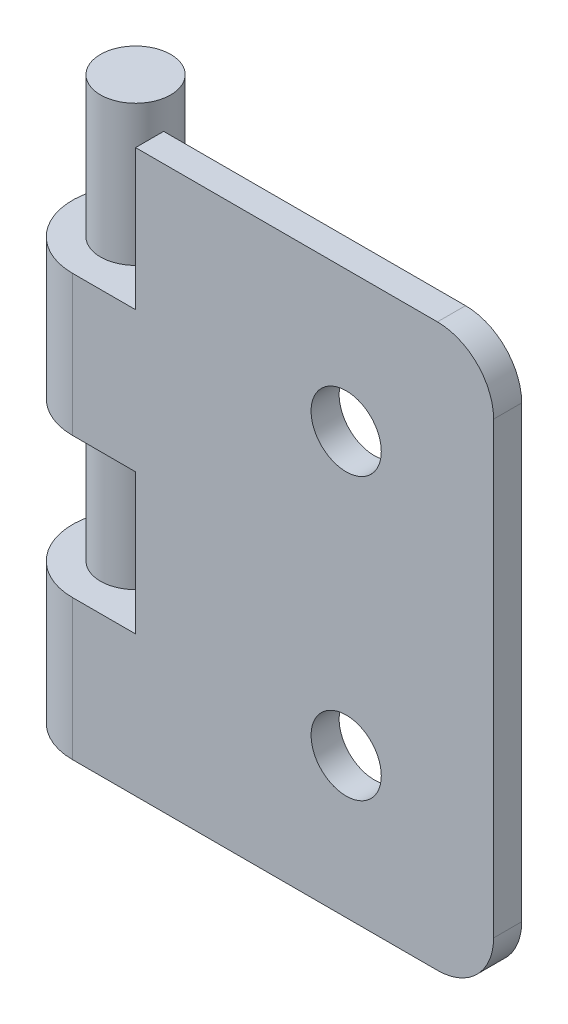
ISO-10303-21;
HEADER;
FILE_DESCRIPTION(('STEP AP214'),'2;1');
FILE_NAME('part.step','',(''),(''),'','','');
FILE_SCHEMA(('AUTOMOTIVE_DESIGN { 1 0 10303 214 1 1 1 1 }'));
ENDSEC;
DATA;
#1=APPLICATION_CONTEXT('core data for automotive mechanical design processes');
#2=APPLICATION_PROTOCOL_DEFINITION('international standard','automotive_design',2000,#1);
#3=PRODUCT_CONTEXT('',#1,'mechanical');
#4=PRODUCT('Part','Part','',(#3));
#5=PRODUCT_RELATED_PRODUCT_CATEGORY('part','',(#4));
#6=PRODUCT_DEFINITION_FORMATION('','',#4);
#7=PRODUCT_DEFINITION_CONTEXT('part definition',#1,'design');
#8=PRODUCT_DEFINITION('design','',#6,#7);
#9=PRODUCT_DEFINITION_SHAPE('','',#8);
#10=(LENGTH_UNIT() NAMED_UNIT(*) SI_UNIT(.MILLI.,.METRE.));
#11=(NAMED_UNIT(*) PLANE_ANGLE_UNIT() SI_UNIT($,.RADIAN.));
#12=(NAMED_UNIT(*) SI_UNIT($,.STERADIAN.) SOLID_ANGLE_UNIT());
#13=UNCERTAINTY_MEASURE_WITH_UNIT(LENGTH_MEASURE(1.E-05),#10,'distance_accuracy_value','');
#14=(GEOMETRIC_REPRESENTATION_CONTEXT(3) GLOBAL_UNCERTAINTY_ASSIGNED_CONTEXT((#13)) GLOBAL_UNIT_ASSIGNED_CONTEXT((#10,
#11,#12)) REPRESENTATION_CONTEXT('',''));
#15=CARTESIAN_POINT('',(0.,0.,0.));
#16=DIRECTION('',(0.,0.,1.));
#17=DIRECTION('',(1.,0.,0.));
#18=AXIS2_PLACEMENT_3D('',#15,#16,#17);
#19=CARTESIAN_POINT('',(0.,40.,0.));
#20=DIRECTION('',(0.,-1.,0.));
#21=DIRECTION('',(0.,0.,-1.));
#22=AXIS2_PLACEMENT_3D('',#19,#20,#21);
#23=CYLINDRICAL_SURFACE('',#22,4.5);
#24=CARTESIAN_POINT('',(0.,30.,0.));
#25=DIRECTION('',(0.,-1.,0.));
#26=DIRECTION('',(0.,0.,-1.));
#27=AXIS2_PLACEMENT_3D('',#24,#25,#26);
#28=CIRCLE('',#27,4.5);
#29=CARTESIAN_POINT('',(0.,30.,4.5));
#30=VERTEX_POINT('',#29);
#31=CARTESIAN_POINT('',(3.74165738677394,30.,2.5));
#32=VERTEX_POINT('',#31);
#33=EDGE_CURVE('E157',#30,#32,#28,.T.);
#34=ORIENTED_EDGE('',*,*,#33,.T.);
#35=DIRECTION('',(0.,-1.,0.));
#36=VECTOR('',#35,1.);
#37=CARTESIAN_POINT('',(3.74165738677394,40.,2.5));
#38=LINE('',#37,#36);
#39=CARTESIAN_POINT('',(3.74165738677394,20.,2.5));
#40=VERTEX_POINT('',#39);
#41=EDGE_CURVE('E187',#32,#40,#38,.T.);
#42=ORIENTED_EDGE('',*,*,#41,.T.);
#43=CARTESIAN_POINT('',(0.,20.,0.));
#44=DIRECTION('',(0.,1.,0.));
#45=DIRECTION('',(0.,0.,1.));
#46=AXIS2_PLACEMENT_3D('',#43,#44,#45);
#47=CIRCLE('',#46,4.5);
#48=CARTESIAN_POINT('',(0.,20.,4.5));
#49=VERTEX_POINT('',#48);
#50=EDGE_CURVE('E245',#40,#49,#47,.T.);
#51=ORIENTED_EDGE('',*,*,#50,.T.);
#52=DIRECTION('',(0.,-1.,0.));
#53=VECTOR('',#52,1.);
#54=CARTESIAN_POINT('',(0.,40.,4.5));
#55=LINE('',#54,#53);
#56=EDGE_CURVE('E195',#30,#49,#55,.T.);
#57=ORIENTED_EDGE('',*,*,#56,.F.);
#58=EDGE_LOOP('',(#34,#42,#51,#57));
#59=FACE_BOUND('',#58,.T.);
#60=ADVANCED_FACE('F35',(#59),#23,.T.);
#61=CARTESIAN_POINT('',(0.,40.,0.));
#62=DIRECTION('',(0.,1.,0.));
#63=DIRECTION('',(0.,0.,1.));
#64=AXIS2_PLACEMENT_3D('',#61,#62,#63);
#65=PLANE('',#64);
#66=DIRECTION('',(1.,0.,0.));
#67=VECTOR('',#66,1.);
#68=CARTESIAN_POINT('',(0.,40.,4.5));
#69=LINE('',#68,#67);
#70=CARTESIAN_POINT('',(4.5,40.,4.5));
#71=VERTEX_POINT('',#70);
#72=CARTESIAN_POINT('',(26.,40.,4.5));
#73=VERTEX_POINT('',#72);
#74=EDGE_CURVE('E173',#71,#73,#69,.T.);
#75=ORIENTED_EDGE('',*,*,#74,.T.);
#76=DIRECTION('',(0.,0.,-1.));
#77=VECTOR('',#76,1.);
#78=CARTESIAN_POINT('',(26.,40.,2.5));
#79=LINE('',#78,#77);
#80=CARTESIAN_POINT('',(26.,40.,2.5));
#81=VERTEX_POINT('',#80);
#82=EDGE_CURVE('E200',#73,#81,#79,.T.);
#83=ORIENTED_EDGE('',*,*,#82,.T.);
#84=DIRECTION('',(-1.,0.,0.));
#85=VECTOR('',#84,1.);
#86=CARTESIAN_POINT('',(30.,40.,2.5));
#87=LINE('',#86,#85);
#88=CARTESIAN_POINT('',(4.5,40.,2.5));
#89=VERTEX_POINT('',#88);
#90=EDGE_CURVE('E176',#81,#89,#87,.T.);
#91=ORIENTED_EDGE('',*,*,#90,.T.);
#92=DIRECTION('',(0.,0.,-1.));
#93=VECTOR('',#92,1.);
#94=CARTESIAN_POINT('',(4.5,40.,22.5));
#95=LINE('',#94,#93);
#96=EDGE_CURVE('E222',#71,#89,#95,.T.);
#97=ORIENTED_EDGE('',*,*,#96,.F.);
#98=EDGE_LOOP('',(#75,#83,#91,#97));
#99=FACE_BOUND('',#98,.T.);
#100=ADVANCED_FACE('F219',(#99),#65,.T.);
#101=CARTESIAN_POINT('',(0.,0.,0.));
#102=DIRECTION('',(0.,1.,0.));
#103=DIRECTION('',(0.,0.,1.));
#104=AXIS2_PLACEMENT_3D('',#101,#102,#103);
#105=PLANE('',#104);
#106=DIRECTION('',(-1.,0.,0.));
#107=VECTOR('',#106,1.);
#108=CARTESIAN_POINT('',(30.,0.,2.5));
#109=LINE('',#108,#107);
#110=CARTESIAN_POINT('',(26.,0.,2.5));
#111=VERTEX_POINT('',#110);
#112=CARTESIAN_POINT('',(3.74165738677394,0.,2.5));
#113=VERTEX_POINT('',#112);
#114=EDGE_CURVE('E177',#111,#113,#109,.T.);
#115=ORIENTED_EDGE('',*,*,#114,.F.);
#116=DIRECTION('',(0.,0.,-1.));
#117=VECTOR('',#116,1.);
#118=CARTESIAN_POINT('',(26.,0.,0.));
#119=LINE('',#118,#117);
#120=CARTESIAN_POINT('',(26.,0.,4.5));
#121=VERTEX_POINT('',#120);
#122=EDGE_CURVE('E11',#111,#121,#119,.F.);
#123=ORIENTED_EDGE('',*,*,#122,.T.);
#124=DIRECTION('',(1.,0.,0.));
#125=VECTOR('',#124,1.);
#126=CARTESIAN_POINT('',(0.,0.,4.5));
#127=LINE('',#126,#125);
#128=CARTESIAN_POINT('',(0.,0.,4.5));
#129=VERTEX_POINT('',#128);
#130=EDGE_CURVE('E182',#129,#121,#127,.T.);
#131=ORIENTED_EDGE('',*,*,#130,.F.);
#132=CARTESIAN_POINT('',(0.,0.,0.));
#133=DIRECTION('',(0.,1.,0.));
#134=DIRECTION('',(0.,0.,1.));
#135=AXIS2_PLACEMENT_3D('',#132,#133,#134);
#136=CIRCLE('',#135,4.5);
#137=EDGE_CURVE('E168',#113,#129,#136,.T.);
#138=ORIENTED_EDGE('',*,*,#137,.F.);
#139=EDGE_LOOP('',(#115,#123,#131,#138));
#140=FACE_BOUND('',#139,.T.);
#141=ADVANCED_FACE('F233',(#140),#105,.F.);
#142=CARTESIAN_POINT('',(0.,10.,0.));
#143=DIRECTION('',(0.,-1.,0.));
#144=DIRECTION('',(1.,0.,0.));
#145=AXIS2_PLACEMENT_3D('',#142,#143,#144);
#146=CIRCLE('',#145,4.5);
#147=CARTESIAN_POINT('',(0.,10.,4.5));
#148=VERTEX_POINT('',#147);
#149=CARTESIAN_POINT('',(3.74165738677394,10.,2.5));
#150=VERTEX_POINT('',#149);
#151=EDGE_CURVE('E130',#148,#150,#146,.T.);
#152=ORIENTED_EDGE('',*,*,#151,.T.);
#153=EDGE_CURVE('E179',#150,#113,#38,.T.);
#154=ORIENTED_EDGE('',*,*,#153,.T.);
#155=ORIENTED_EDGE('',*,*,#137,.T.);
#156=EDGE_CURVE('E193',#148,#129,#55,.T.);
#157=ORIENTED_EDGE('',*,*,#156,.F.);
#158=EDGE_LOOP('',(#152,#154,#155,#157));
#159=FACE_BOUND('',#158,.T.);
#160=ADVANCED_FACE('F235',(#159),#23,.T.);
#161=CARTESIAN_POINT('',(0.,40.,4.5));
#162=DIRECTION('',(0.,0.,-1.));
#163=DIRECTION('',(-1.,0.,0.));
#164=AXIS2_PLACEMENT_3D('',#161,#162,#163);
#165=PLANE('',#164);
#166=CARTESIAN_POINT('',(19.5,30.,4.5));
#167=DIRECTION('',(0.,0.,1.));
#168=DIRECTION('',(1.,0.,0.));
#169=AXIS2_PLACEMENT_3D('',#166,#167,#168);
#170=CIRCLE('',#169,2.5);
#171=CARTESIAN_POINT('',(22.,30.,4.5));
#172=VERTEX_POINT('',#171);
#173=EDGE_CURVE('E161',#172,#172,#170,.T.);
#174=ORIENTED_EDGE('',*,*,#173,.F.);
#175=EDGE_LOOP('',(#174));
#176=FACE_BOUND('',#175,.T.);
#177=CARTESIAN_POINT('',(19.5,10.,4.5));
#178=DIRECTION('',(0.,0.,1.));
#179=DIRECTION('',(-1.,0.,0.));
#180=AXIS2_PLACEMENT_3D('',#177,#178,#179);
#181=CIRCLE('',#180,2.5);
#182=CARTESIAN_POINT('',(17.,10.,4.5));
#183=VERTEX_POINT('',#182);
#184=EDGE_CURVE('E154',#183,#183,#181,.T.);
#185=ORIENTED_EDGE('',*,*,#184,.F.);
#186=EDGE_LOOP('',(#185));
#187=FACE_BOUND('',#186,.T.);
#188=DIRECTION('',(0.,-1.,0.));
#189=VECTOR('',#188,1.);
#190=CARTESIAN_POINT('',(30.,40.,4.5));
#191=LINE('',#190,#189);
#192=CARTESIAN_POINT('',(30.,36.,4.5));
#193=VERTEX_POINT('',#192);
#194=CARTESIAN_POINT('',(30.,4.,4.5));
#195=VERTEX_POINT('',#194);
#196=EDGE_CURVE('E191',#193,#195,#191,.T.);
#197=ORIENTED_EDGE('',*,*,#196,.F.);
#198=CARTESIAN_POINT('',(26.,36.,4.5));
#199=DIRECTION('',(0.,0.,-1.));
#200=DIRECTION('',(-1.,0.,0.));
#201=AXIS2_PLACEMENT_3D('',#198,#199,#200);
#202=CIRCLE('',#201,4.);
#203=EDGE_CURVE('E43',#193,#73,#202,.F.);
#204=ORIENTED_EDGE('',*,*,#203,.T.);
#205=ORIENTED_EDGE('',*,*,#74,.F.);
#206=DIRECTION('',(0.,-1.,0.));
#207=VECTOR('',#206,1.);
#208=CARTESIAN_POINT('',(4.5,40.,4.5));
#209=LINE('',#208,#207);
#210=CARTESIAN_POINT('',(4.5,30.,4.5));
#211=VERTEX_POINT('',#210);
#212=EDGE_CURVE('E150',#71,#211,#209,.T.);
#213=ORIENTED_EDGE('',*,*,#212,.T.);
#214=DIRECTION('',(-1.,0.,0.));
#215=VECTOR('',#214,1.);
#216=CARTESIAN_POINT('',(0.,30.,4.5));
#217=LINE('',#216,#215);
#218=EDGE_CURVE('E151',#211,#30,#217,.T.);
#219=ORIENTED_EDGE('',*,*,#218,.T.);
#220=ORIENTED_EDGE('',*,*,#56,.T.);
#221=DIRECTION('',(1.,0.,0.));
#222=VECTOR('',#221,1.);
#223=CARTESIAN_POINT('',(0.,20.,4.5));
#224=LINE('',#223,#222);
#225=CARTESIAN_POINT('',(4.5,20.,4.5));
#226=VERTEX_POINT('',#225);
#227=EDGE_CURVE('E149',#49,#226,#224,.T.);
#228=ORIENTED_EDGE('',*,*,#227,.T.);
#229=DIRECTION('',(0.,-1.,0.));
#230=VECTOR('',#229,1.);
#231=CARTESIAN_POINT('',(4.5,40.,4.5));
#232=LINE('',#231,#230);
#233=CARTESIAN_POINT('',(4.5,10.,4.5));
#234=VERTEX_POINT('',#233);
#235=EDGE_CURVE('E138',#226,#234,#232,.T.);
#236=ORIENTED_EDGE('',*,*,#235,.T.);
#237=DIRECTION('',(-1.,0.,0.));
#238=VECTOR('',#237,1.);
#239=CARTESIAN_POINT('',(0.,10.,4.5));
#240=LINE('',#239,#238);
#241=EDGE_CURVE('E124',#234,#148,#240,.T.);
#242=ORIENTED_EDGE('',*,*,#241,.T.);
#243=ORIENTED_EDGE('',*,*,#156,.T.);
#244=ORIENTED_EDGE('',*,*,#130,.T.);
#245=CARTESIAN_POINT('',(26.,4.,4.5));
#246=DIRECTION('',(0.,0.,-1.));
#247=DIRECTION('',(-1.,0.,0.));
#248=AXIS2_PLACEMENT_3D('',#245,#246,#247);
#249=CIRCLE('',#248,4.);
#250=EDGE_CURVE('E55',#121,#195,#249,.F.);
#251=ORIENTED_EDGE('',*,*,#250,.T.);
#252=EDGE_LOOP('',(#197,#204,#205,#213,#219,#220,#228,#236,#242,#243,#244,#251));
#253=FACE_BOUND('',#252,.T.);
#254=ADVANCED_FACE('F147',(#176,#187,#253),#165,.F.);
#255=CARTESIAN_POINT('',(30.,40.,4.5));
#256=DIRECTION('',(-1.,0.,0.));
#257=DIRECTION('',(0.,0.,1.));
#258=AXIS2_PLACEMENT_3D('',#255,#256,#257);
#259=PLANE('',#258);
#260=DIRECTION('',(0.,-1.,0.));
#261=VECTOR('',#260,1.);
#262=CARTESIAN_POINT('',(30.,40.,2.5));
#263=LINE('',#262,#261);
#264=CARTESIAN_POINT('',(30.,36.,2.5));
#265=VERTEX_POINT('',#264);
#266=CARTESIAN_POINT('',(30.,4.,2.5));
#267=VERTEX_POINT('',#266);
#268=EDGE_CURVE('E188',#265,#267,#263,.T.);
#269=ORIENTED_EDGE('',*,*,#268,.F.);
#270=DIRECTION('',(0.,0.,-1.));
#271=VECTOR('',#270,1.);
#272=CARTESIAN_POINT('',(30.,36.,4.5));
#273=LINE('',#272,#271);
#274=EDGE_CURVE('E210',#265,#193,#273,.F.);
#275=ORIENTED_EDGE('',*,*,#274,.T.);
#276=ORIENTED_EDGE('',*,*,#196,.T.);
#277=DIRECTION('',(0.,0.,-1.));
#278=VECTOR('',#277,1.);
#279=CARTESIAN_POINT('',(30.,4.,4.5));
#280=LINE('',#279,#278);
#281=EDGE_CURVE('E207',#195,#267,#280,.T.);
#282=ORIENTED_EDGE('',*,*,#281,.T.);
#283=EDGE_LOOP('',(#269,#275,#276,#282));
#284=FACE_BOUND('',#283,.T.);
#285=ADVANCED_FACE('F228',(#284),#259,.F.);
#286=CARTESIAN_POINT('',(30.,40.,2.5));
#287=DIRECTION('',(0.,0.,1.));
#288=DIRECTION('',(1.,0.,0.));
#289=AXIS2_PLACEMENT_3D('',#286,#287,#288);
#290=PLANE('',#289);
#291=CARTESIAN_POINT('',(19.5,30.,2.5));
#292=DIRECTION('',(0.,0.,1.));
#293=DIRECTION('',(1.,0.,0.));
#294=AXIS2_PLACEMENT_3D('',#291,#292,#293);
#295=CIRCLE('',#294,2.5);
#296=CARTESIAN_POINT('',(22.,30.,2.5));
#297=VERTEX_POINT('',#296);
#298=EDGE_CURVE('E164',#297,#297,#295,.F.);
#299=ORIENTED_EDGE('',*,*,#298,.F.);
#300=EDGE_LOOP('',(#299));
#301=FACE_BOUND('',#300,.T.);
#302=CARTESIAN_POINT('',(19.5,10.,2.5));
#303=DIRECTION('',(0.,0.,1.));
#304=DIRECTION('',(1.,0.,0.));
#305=AXIS2_PLACEMENT_3D('',#302,#303,#304);
#306=CIRCLE('',#305,2.5);
#307=CARTESIAN_POINT('',(22.,10.,2.5));
#308=VERTEX_POINT('',#307);
#309=EDGE_CURVE('E165',#308,#308,#306,.F.);
#310=ORIENTED_EDGE('',*,*,#309,.F.);
#311=EDGE_LOOP('',(#310));
#312=FACE_BOUND('',#311,.T.);
#313=ORIENTED_EDGE('',*,*,#90,.F.);
#314=CARTESIAN_POINT('',(26.,36.,2.5));
#315=DIRECTION('',(0.,0.,1.));
#316=DIRECTION('',(1.,0.,0.));
#317=AXIS2_PLACEMENT_3D('',#314,#315,#316);
#318=CIRCLE('',#317,4.);
#319=EDGE_CURVE('E205',#81,#265,#318,.F.);
#320=ORIENTED_EDGE('',*,*,#319,.T.);
#321=ORIENTED_EDGE('',*,*,#268,.T.);
#322=CARTESIAN_POINT('',(26.,4.,2.5));
#323=DIRECTION('',(0.,0.,1.));
#324=DIRECTION('',(1.,0.,0.));
#325=AXIS2_PLACEMENT_3D('',#322,#323,#324);
#326=CIRCLE('',#325,4.);
#327=EDGE_CURVE('E203',#267,#111,#326,.F.);
#328=ORIENTED_EDGE('',*,*,#327,.T.);
#329=ORIENTED_EDGE('',*,*,#114,.T.);
#330=ORIENTED_EDGE('',*,*,#153,.F.);
#331=DIRECTION('',(1.,0.,0.));
#332=VECTOR('',#331,1.);
#333=CARTESIAN_POINT('',(30.,10.,2.5));
#334=LINE('',#333,#332);
#335=CARTESIAN_POINT('',(4.5,10.,2.5));
#336=VERTEX_POINT('',#335);
#337=EDGE_CURVE('E236',#150,#336,#334,.T.);
#338=ORIENTED_EDGE('',*,*,#337,.T.);
#339=DIRECTION('',(0.,1.,0.));
#340=VECTOR('',#339,1.);
#341=CARTESIAN_POINT('',(4.5,40.,2.5));
#342=LINE('',#341,#340);
#343=CARTESIAN_POINT('',(4.5,20.,2.5));
#344=VERTEX_POINT('',#343);
#345=EDGE_CURVE('E141',#336,#344,#342,.T.);
#346=ORIENTED_EDGE('',*,*,#345,.T.);
#347=DIRECTION('',(-1.,0.,0.));
#348=VECTOR('',#347,1.);
#349=CARTESIAN_POINT('',(30.,20.,2.5));
#350=LINE('',#349,#348);
#351=EDGE_CURVE('E133',#344,#40,#350,.T.);
#352=ORIENTED_EDGE('',*,*,#351,.T.);
#353=ORIENTED_EDGE('',*,*,#41,.F.);
#354=DIRECTION('',(1.,0.,0.));
#355=VECTOR('',#354,1.);
#356=CARTESIAN_POINT('',(30.,30.,2.5));
#357=LINE('',#356,#355);
#358=CARTESIAN_POINT('',(4.5,30.,2.5));
#359=VERTEX_POINT('',#358);
#360=EDGE_CURVE('E249',#32,#359,#357,.T.);
#361=ORIENTED_EDGE('',*,*,#360,.T.);
#362=DIRECTION('',(0.,1.,0.));
#363=VECTOR('',#362,1.);
#364=CARTESIAN_POINT('',(4.5,40.,2.5));
#365=LINE('',#364,#363);
#366=EDGE_CURVE('E197',#359,#89,#365,.T.);
#367=ORIENTED_EDGE('',*,*,#366,.T.);
#368=EDGE_LOOP('',(#313,#320,#321,#328,#329,#330,#338,#346,#352,#353,#361,#367));
#369=FACE_BOUND('',#368,.T.);
#370=ADVANCED_FACE('F226',(#301,#312,#369),#290,.F.);
#371=CARTESIAN_POINT('',(19.5,10.,-4.501));
#372=DIRECTION('',(0.,0.,1.));
#373=DIRECTION('',(1.,0.,0.));
#374=AXIS2_PLACEMENT_3D('',#371,#372,#373);
#375=CYLINDRICAL_SURFACE('',#374,2.5);
#376=ORIENTED_EDGE('',*,*,#184,.T.);
#377=EDGE_LOOP('',(#376));
#378=FACE_BOUND('',#377,.T.);
#379=ORIENTED_EDGE('',*,*,#309,.T.);
#380=EDGE_LOOP('',(#379));
#381=FACE_BOUND('',#380,.T.);
#382=ADVANCED_FACE('F308',(#378,#381),#375,.F.);
#383=CARTESIAN_POINT('',(19.5,30.,-4.501));
#384=DIRECTION('',(0.,0.,1.));
#385=DIRECTION('',(1.,0.,0.));
#386=AXIS2_PLACEMENT_3D('',#383,#384,#385);
#387=CYLINDRICAL_SURFACE('',#386,2.5);
#388=ORIENTED_EDGE('',*,*,#173,.T.);
#389=EDGE_LOOP('',(#388));
#390=FACE_BOUND('',#389,.T.);
#391=ORIENTED_EDGE('',*,*,#298,.T.);
#392=EDGE_LOOP('',(#391));
#393=FACE_BOUND('',#392,.T.);
#394=ADVANCED_FACE('F326',(#390,#393),#387,.F.);
#395=CARTESIAN_POINT('',(4.5,20.,22.5));
#396=DIRECTION('',(1.,0.,0.));
#397=DIRECTION('',(0.,1.,0.));
#398=AXIS2_PLACEMENT_3D('',#395,#396,#397);
#399=PLANE('',#398);
#400=DIRECTION('',(0.,0.,-1.));
#401=VECTOR('',#400,1.);
#402=CARTESIAN_POINT('',(4.5,20.,22.5));
#403=LINE('',#402,#401);
#404=EDGE_CURVE('E143',#226,#344,#403,.T.);
#405=ORIENTED_EDGE('',*,*,#404,.T.);
#406=ORIENTED_EDGE('',*,*,#345,.F.);
#407=DIRECTION('',(0.,0.,-1.));
#408=VECTOR('',#407,1.);
#409=CARTESIAN_POINT('',(4.5,10.,22.5));
#410=LINE('',#409,#408);
#411=EDGE_CURVE('E128',#234,#336,#410,.T.);
#412=ORIENTED_EDGE('',*,*,#411,.F.);
#413=ORIENTED_EDGE('',*,*,#235,.F.);
#414=EDGE_LOOP('',(#405,#406,#412,#413));
#415=FACE_BOUND('',#414,.T.);
#416=ADVANCED_FACE('F137',(#415),#399,.F.);
#417=CARTESIAN_POINT('',(4.5,20.,22.5));
#418=DIRECTION('',(0.,1.,0.));
#419=DIRECTION('',(0.,0.,1.));
#420=AXIS2_PLACEMENT_3D('',#417,#418,#419);
#421=PLANE('',#420);
#422=CARTESIAN_POINT('',(0.,20.,0.));
#423=DIRECTION('',(0.,1.,0.));
#424=DIRECTION('',(0.,0.,1.));
#425=AXIS2_PLACEMENT_3D('',#422,#423,#424);
#426=CIRCLE('',#425,2.5);
#427=CARTESIAN_POINT('',(0.,20.,2.5));
#428=VERTEX_POINT('',#427);
#429=EDGE_CURVE('E144',#428,#428,#426,.T.);
#430=ORIENTED_EDGE('',*,*,#429,.T.);
#431=EDGE_LOOP('',(#430));
#432=FACE_BOUND('',#431,.T.);
#433=ORIENTED_EDGE('',*,*,#50,.F.);
#434=ORIENTED_EDGE('',*,*,#351,.F.);
#435=ORIENTED_EDGE('',*,*,#404,.F.);
#436=ORIENTED_EDGE('',*,*,#227,.F.);
#437=EDGE_LOOP('',(#433,#434,#435,#436));
#438=FACE_BOUND('',#437,.T.);
#439=ADVANCED_FACE('F261',(#432,#438),#421,.F.);
#440=CARTESIAN_POINT('',(4.5,10.,22.5));
#441=DIRECTION('',(0.,-1.,0.));
#442=DIRECTION('',(1.,0.,0.));
#443=AXIS2_PLACEMENT_3D('',#440,#441,#442);
#444=PLANE('',#443);
#445=CARTESIAN_POINT('',(0.,10.,0.));
#446=DIRECTION('',(0.,-1.,0.));
#447=DIRECTION('',(1.,0.,0.));
#448=AXIS2_PLACEMENT_3D('',#445,#446,#447);
#449=CIRCLE('',#448,2.5);
#450=CARTESIAN_POINT('',(2.5,10.,0.));
#451=VERTEX_POINT('',#450);
#452=EDGE_CURVE('E266',#451,#451,#449,.T.);
#453=ORIENTED_EDGE('',*,*,#452,.T.);
#454=EDGE_LOOP('',(#453));
#455=FACE_BOUND('',#454,.T.);
#456=ORIENTED_EDGE('',*,*,#411,.T.);
#457=ORIENTED_EDGE('',*,*,#337,.F.);
#458=ORIENTED_EDGE('',*,*,#151,.F.);
#459=ORIENTED_EDGE('',*,*,#241,.F.);
#460=EDGE_LOOP('',(#456,#457,#458,#459));
#461=FACE_BOUND('',#460,.T.);
#462=ADVANCED_FACE('F126',(#455,#461),#444,.F.);
#463=CARTESIAN_POINT('',(4.5,40.,22.5));
#464=DIRECTION('',(1.,0.,0.));
#465=DIRECTION('',(0.,1.,0.));
#466=AXIS2_PLACEMENT_3D('',#463,#464,#465);
#467=PLANE('',#466);
#468=ORIENTED_EDGE('',*,*,#96,.T.);
#469=ORIENTED_EDGE('',*,*,#366,.F.);
#470=DIRECTION('',(0.,0.,-1.));
#471=VECTOR('',#470,1.);
#472=CARTESIAN_POINT('',(4.5,30.,22.5));
#473=LINE('',#472,#471);
#474=EDGE_CURVE('E240',#211,#359,#473,.T.);
#475=ORIENTED_EDGE('',*,*,#474,.F.);
#476=ORIENTED_EDGE('',*,*,#212,.F.);
#477=EDGE_LOOP('',(#468,#469,#475,#476));
#478=FACE_BOUND('',#477,.T.);
#479=ADVANCED_FACE('F353',(#478),#467,.F.);
#480=CARTESIAN_POINT('',(4.5,30.,22.5));
#481=DIRECTION('',(0.,-1.,0.));
#482=DIRECTION('',(0.,0.,-1.));
#483=AXIS2_PLACEMENT_3D('',#480,#481,#482);
#484=PLANE('',#483);
#485=CARTESIAN_POINT('',(0.,30.,0.));
#486=DIRECTION('',(0.,-1.,0.));
#487=DIRECTION('',(0.,0.,-1.));
#488=AXIS2_PLACEMENT_3D('',#485,#486,#487);
#489=CIRCLE('',#488,2.5);
#490=CARTESIAN_POINT('',(0.,30.,-2.5));
#491=VERTEX_POINT('',#490);
#492=EDGE_CURVE('E269',#491,#491,#489,.T.);
#493=ORIENTED_EDGE('',*,*,#492,.T.);
#494=EDGE_LOOP('',(#493));
#495=FACE_BOUND('',#494,.T.);
#496=ORIENTED_EDGE('',*,*,#474,.T.);
#497=ORIENTED_EDGE('',*,*,#360,.F.);
#498=ORIENTED_EDGE('',*,*,#33,.F.);
#499=ORIENTED_EDGE('',*,*,#218,.F.);
#500=EDGE_LOOP('',(#496,#497,#498,#499));
#501=FACE_BOUND('',#500,.T.);
#502=ADVANCED_FACE('F257',(#495,#501),#484,.F.);
#503=CARTESIAN_POINT('',(26.,36.,0.));
#504=DIRECTION('',(0.,0.,1.));
#505=DIRECTION('',(1.,0.,0.));
#506=AXIS2_PLACEMENT_3D('',#503,#504,#505);
#507=CYLINDRICAL_SURFACE('',#506,4.);
#508=ORIENTED_EDGE('',*,*,#203,.F.);
#509=ORIENTED_EDGE('',*,*,#274,.F.);
#510=ORIENTED_EDGE('',*,*,#319,.F.);
#511=ORIENTED_EDGE('',*,*,#82,.F.);
#512=EDGE_LOOP('',(#508,#509,#510,#511));
#513=FACE_BOUND('',#512,.T.);
#514=ADVANCED_FACE('F223',(#513),#507,.T.);
#515=CARTESIAN_POINT('',(26.,4.,4.5));
#516=DIRECTION('',(0.,0.,-1.));
#517=DIRECTION('',(-1.,0.,0.));
#518=AXIS2_PLACEMENT_3D('',#515,#516,#517);
#519=CYLINDRICAL_SURFACE('',#518,4.);
#520=ORIENTED_EDGE('',*,*,#250,.F.);
#521=ORIENTED_EDGE('',*,*,#122,.F.);
#522=ORIENTED_EDGE('',*,*,#327,.F.);
#523=ORIENTED_EDGE('',*,*,#281,.F.);
#524=EDGE_LOOP('',(#520,#521,#522,#523));
#525=FACE_BOUND('',#524,.T.);
#526=ADVANCED_FACE('F37',(#525),#519,.T.);
#527=CARTESIAN_POINT('',(0.,40.,0.));
#528=DIRECTION('',(0.,-1.,0.));
#529=DIRECTION('',(0.,0.,-1.));
#530=AXIS2_PLACEMENT_3D('',#527,#528,#529);
#531=PLANE('',#530);
#532=CARTESIAN_POINT('',(0.,40.,0.));
#533=DIRECTION('',(0.,-1.,0.));
#534=DIRECTION('',(0.,0.,-1.));
#535=AXIS2_PLACEMENT_3D('',#532,#533,#534);
#536=CIRCLE('',#535,2.5);
#537=CARTESIAN_POINT('',(0.,40.,-2.5));
#538=VERTEX_POINT('',#537);
#539=EDGE_CURVE('E272',#538,#538,#536,.T.);
#540=ORIENTED_EDGE('',*,*,#539,.F.);
#541=EDGE_LOOP('',(#540));
#542=FACE_BOUND('',#541,.T.);
#543=ADVANCED_FACE('F279',(#542),#531,.F.);
#544=CARTESIAN_POINT('',(0.,40.,0.));
#545=DIRECTION('',(0.,-1.,0.));
#546=DIRECTION('',(0.,0.,-1.));
#547=AXIS2_PLACEMENT_3D('',#544,#545,#546);
#548=CYLINDRICAL_SURFACE('',#547,2.5);
#549=ORIENTED_EDGE('',*,*,#539,.T.);
#550=EDGE_LOOP('',(#549));
#551=FACE_BOUND('',#550,.T.);
#552=ORIENTED_EDGE('',*,*,#492,.F.);
#553=EDGE_LOOP('',(#552));
#554=FACE_BOUND('',#553,.T.);
#555=ADVANCED_FACE('F276',(#551,#554),#548,.T.);
#556=ORIENTED_EDGE('',*,*,#452,.F.);
#557=EDGE_LOOP('',(#556));
#558=FACE_BOUND('',#557,.T.);
#559=ORIENTED_EDGE('',*,*,#429,.F.);
#560=EDGE_LOOP('',(#559));
#561=FACE_BOUND('',#560,.T.);
#562=ADVANCED_FACE('F286',(#558,#561),#548,.T.);
#563=CLOSED_SHELL('',(#60,#100,#141,#160,#254,#285,#370,#382,#394,#416,#439,#462,#479,#502,#514,
#526,#543,#555,#562));
#564=MANIFOLD_SOLID_BREP('B2',#563);
#565=ADVANCED_BREP_SHAPE_REPRESENTATION('',(#18,#564),#14);
#566=SHAPE_DEFINITION_REPRESENTATION(#9,#565);
ENDSEC;
END-ISO-10303-21;
